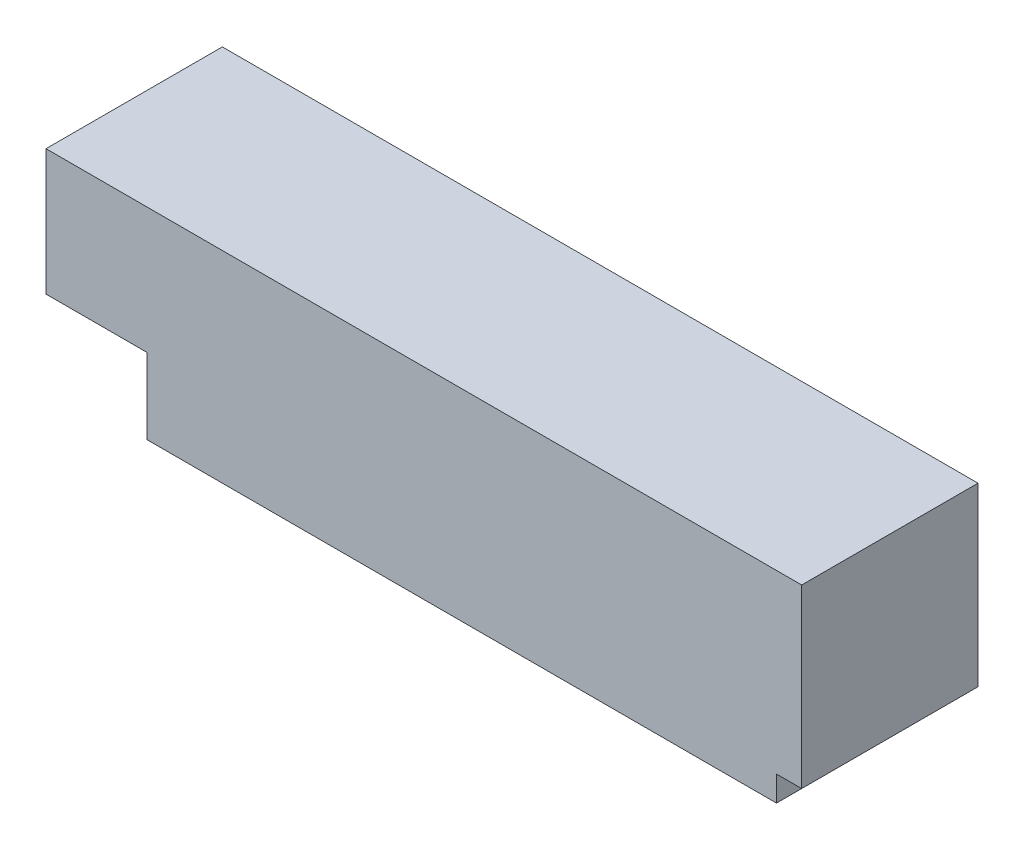
ISO-10303-21;
HEADER;
FILE_DESCRIPTION(('STEP AP214'),'2;1');
FILE_NAME('part.step','',(''),(''),'','','');
FILE_SCHEMA(('AUTOMOTIVE_DESIGN { 1 0 10303 214 1 1 1 1 }'));
ENDSEC;
DATA;
#1=APPLICATION_CONTEXT('core data for automotive mechanical design processes');
#2=APPLICATION_PROTOCOL_DEFINITION('international standard','automotive_design',2000,#1);
#3=PRODUCT_CONTEXT('',#1,'mechanical');
#4=PRODUCT('Part','Part','',(#3));
#5=PRODUCT_RELATED_PRODUCT_CATEGORY('part','',(#4));
#6=PRODUCT_DEFINITION_FORMATION('','',#4);
#7=PRODUCT_DEFINITION_CONTEXT('part definition',#1,'design');
#8=PRODUCT_DEFINITION('design','',#6,#7);
#9=PRODUCT_DEFINITION_SHAPE('','',#8);
#10=(LENGTH_UNIT() NAMED_UNIT(*) SI_UNIT(.MILLI.,.METRE.));
#11=(NAMED_UNIT(*) PLANE_ANGLE_UNIT() SI_UNIT($,.RADIAN.));
#12=(NAMED_UNIT(*) SI_UNIT($,.STERADIAN.) SOLID_ANGLE_UNIT());
#13=UNCERTAINTY_MEASURE_WITH_UNIT(LENGTH_MEASURE(1.E-05),#10,'distance_accuracy_value','');
#14=(GEOMETRIC_REPRESENTATION_CONTEXT(3) GLOBAL_UNCERTAINTY_ASSIGNED_CONTEXT((#13)) GLOBAL_UNIT_ASSIGNED_CONTEXT((#10,
#11,#12)) REPRESENTATION_CONTEXT('',''));
#15=CARTESIAN_POINT('',(0.,0.,0.));
#16=DIRECTION('',(0.,0.,1.));
#17=DIRECTION('',(1.,0.,0.));
#18=AXIS2_PLACEMENT_3D('',#15,#16,#17);
#19=CARTESIAN_POINT('',(25.,0.,7.));
#20=DIRECTION('',(0.,1.,0.));
#21=DIRECTION('',(-1.,0.,0.));
#22=AXIS2_PLACEMENT_3D('',#19,#20,#21);
#23=PLANE('',#22);
#24=DIRECTION('',(1.,0.,0.));
#25=VECTOR('',#24,1.);
#26=CARTESIAN_POINT('',(25.,0.,0.));
#27=LINE('',#26,#25);
#28=CARTESIAN_POINT('',(0.,0.,0.));
#29=VERTEX_POINT('',#28);
#30=CARTESIAN_POINT('',(25.,0.,0.));
#31=VERTEX_POINT('',#30);
#32=EDGE_CURVE('E129',#29,#31,#27,.T.);
#33=ORIENTED_EDGE('',*,*,#32,.T.);
#34=DIRECTION('',(0.,0.,-1.));
#35=VECTOR('',#34,1.);
#36=CARTESIAN_POINT('',(25.,0.,7.));
#37=LINE('',#36,#35);
#38=CARTESIAN_POINT('',(25.,0.,7.));
#39=VERTEX_POINT('',#38);
#40=EDGE_CURVE('E11',#39,#31,#37,.T.);
#41=ORIENTED_EDGE('',*,*,#40,.F.);
#42=DIRECTION('',(1.,0.,0.));
#43=VECTOR('',#42,1.);
#44=CARTESIAN_POINT('',(25.,0.,7.));
#45=LINE('',#44,#43);
#46=CARTESIAN_POINT('',(0.,0.,7.));
#47=VERTEX_POINT('',#46);
#48=EDGE_CURVE('E144',#47,#39,#45,.T.);
#49=ORIENTED_EDGE('',*,*,#48,.F.);
#50=DIRECTION('',(0.,0.,-1.));
#51=VECTOR('',#50,1.);
#52=CARTESIAN_POINT('',(0.,0.,7.));
#53=LINE('',#52,#51);
#54=EDGE_CURVE('E125',#47,#29,#53,.T.);
#55=ORIENTED_EDGE('',*,*,#54,.T.);
#56=EDGE_LOOP('',(#33,#41,#49,#55));
#57=FACE_BOUND('',#56,.T.);
#58=ADVANCED_FACE('F33',(#57),#23,.F.);
#59=CARTESIAN_POINT('',(25.,1.,7.));
#60=DIRECTION('',(-1.,0.,0.));
#61=DIRECTION('',(0.,0.,1.));
#62=AXIS2_PLACEMENT_3D('',#59,#60,#61);
#63=PLANE('',#62);
#64=DIRECTION('',(0.,1.,0.));
#65=VECTOR('',#64,1.);
#66=CARTESIAN_POINT('',(25.,1.,0.));
#67=LINE('',#66,#65);
#68=CARTESIAN_POINT('',(25.,1.,0.));
#69=VERTEX_POINT('',#68);
#70=EDGE_CURVE('E132',#31,#69,#67,.T.);
#71=ORIENTED_EDGE('',*,*,#70,.T.);
#72=DIRECTION('',(0.,0.,-1.));
#73=VECTOR('',#72,1.);
#74=CARTESIAN_POINT('',(25.,1.,7.));
#75=LINE('',#74,#73);
#76=CARTESIAN_POINT('',(25.,1.,7.));
#77=VERTEX_POINT('',#76);
#78=EDGE_CURVE('E41',#77,#69,#75,.T.);
#79=ORIENTED_EDGE('',*,*,#78,.F.);
#80=DIRECTION('',(0.,1.,0.));
#81=VECTOR('',#80,1.);
#82=CARTESIAN_POINT('',(25.,1.,7.));
#83=LINE('',#82,#81);
#84=EDGE_CURVE('E92',#39,#77,#83,.T.);
#85=ORIENTED_EDGE('',*,*,#84,.F.);
#86=ORIENTED_EDGE('',*,*,#40,.T.);
#87=EDGE_LOOP('',(#71,#79,#85,#86));
#88=FACE_BOUND('',#87,.T.);
#89=ADVANCED_FACE('F178',(#88),#63,.F.);
#90=CARTESIAN_POINT('',(26.,1.,7.));
#91=DIRECTION('',(0.,1.,0.));
#92=DIRECTION('',(-1.,0.,0.));
#93=AXIS2_PLACEMENT_3D('',#90,#91,#92);
#94=PLANE('',#93);
#95=DIRECTION('',(1.,0.,0.));
#96=VECTOR('',#95,1.);
#97=CARTESIAN_POINT('',(26.,1.,0.));
#98=LINE('',#97,#96);
#99=CARTESIAN_POINT('',(26.,1.,0.));
#100=VERTEX_POINT('',#99);
#101=EDGE_CURVE('E134',#69,#100,#98,.T.);
#102=ORIENTED_EDGE('',*,*,#101,.T.);
#103=DIRECTION('',(0.,0.,-1.));
#104=VECTOR('',#103,1.);
#105=CARTESIAN_POINT('',(26.,1.,7.));
#106=LINE('',#105,#104);
#107=CARTESIAN_POINT('',(26.,1.,7.));
#108=VERTEX_POINT('',#107);
#109=EDGE_CURVE('E151',#108,#100,#106,.T.);
#110=ORIENTED_EDGE('',*,*,#109,.F.);
#111=DIRECTION('',(1.,0.,0.));
#112=VECTOR('',#111,1.);
#113=CARTESIAN_POINT('',(26.,1.,7.));
#114=LINE('',#113,#112);
#115=EDGE_CURVE('E159',#77,#108,#114,.T.);
#116=ORIENTED_EDGE('',*,*,#115,.F.);
#117=ORIENTED_EDGE('',*,*,#78,.T.);
#118=EDGE_LOOP('',(#102,#110,#116,#117));
#119=FACE_BOUND('',#118,.T.);
#120=ADVANCED_FACE('F157',(#119),#94,.F.);
#121=CARTESIAN_POINT('',(26.,8.,7.));
#122=DIRECTION('',(-1.,0.,0.));
#123=DIRECTION('',(0.,0.,1.));
#124=AXIS2_PLACEMENT_3D('',#121,#122,#123);
#125=PLANE('',#124);
#126=DIRECTION('',(0.,1.,0.));
#127=VECTOR('',#126,1.);
#128=CARTESIAN_POINT('',(26.,8.,0.));
#129=LINE('',#128,#127);
#130=CARTESIAN_POINT('',(26.,8.,0.));
#131=VERTEX_POINT('',#130);
#132=EDGE_CURVE('E136',#100,#131,#129,.T.);
#133=ORIENTED_EDGE('',*,*,#132,.T.);
#134=DIRECTION('',(0.,0.,-1.));
#135=VECTOR('',#134,1.);
#136=CARTESIAN_POINT('',(26.,8.,7.));
#137=LINE('',#136,#135);
#138=CARTESIAN_POINT('',(26.,8.,7.));
#139=VERTEX_POINT('',#138);
#140=EDGE_CURVE('E148',#139,#131,#137,.T.);
#141=ORIENTED_EDGE('',*,*,#140,.F.);
#142=DIRECTION('',(0.,1.,0.));
#143=VECTOR('',#142,1.);
#144=CARTESIAN_POINT('',(26.,8.,7.));
#145=LINE('',#144,#143);
#146=EDGE_CURVE('E170',#108,#139,#145,.T.);
#147=ORIENTED_EDGE('',*,*,#146,.F.);
#148=ORIENTED_EDGE('',*,*,#109,.T.);
#149=EDGE_LOOP('',(#133,#141,#147,#148));
#150=FACE_BOUND('',#149,.T.);
#151=ADVANCED_FACE('F166',(#150),#125,.F.);
#152=CARTESIAN_POINT('',(-4.,8.,7.));
#153=DIRECTION('',(0.,-1.,0.));
#154=DIRECTION('',(0.,0.,-1.));
#155=AXIS2_PLACEMENT_3D('',#152,#153,#154);
#156=PLANE('',#155);
#157=DIRECTION('',(-1.,0.,0.));
#158=VECTOR('',#157,1.);
#159=CARTESIAN_POINT('',(-4.,8.,0.));
#160=LINE('',#159,#158);
#161=CARTESIAN_POINT('',(-4.,8.,0.));
#162=VERTEX_POINT('',#161);
#163=EDGE_CURVE('E139',#131,#162,#160,.T.);
#164=ORIENTED_EDGE('',*,*,#163,.T.);
#165=DIRECTION('',(0.,0.,-1.));
#166=VECTOR('',#165,1.);
#167=CARTESIAN_POINT('',(-4.,8.,7.));
#168=LINE('',#167,#166);
#169=CARTESIAN_POINT('',(-4.,8.,7.));
#170=VERTEX_POINT('',#169);
#171=EDGE_CURVE('E120',#170,#162,#168,.T.);
#172=ORIENTED_EDGE('',*,*,#171,.F.);
#173=DIRECTION('',(-1.,0.,0.));
#174=VECTOR('',#173,1.);
#175=CARTESIAN_POINT('',(3.30664659583847,8.,7.));
#176=LINE('',#175,#174);
#177=EDGE_CURVE('E111',#139,#170,#176,.T.);
#178=ORIENTED_EDGE('',*,*,#177,.F.);
#179=ORIENTED_EDGE('',*,*,#140,.T.);
#180=EDGE_LOOP('',(#164,#172,#178,#179));
#181=FACE_BOUND('',#180,.T.);
#182=ADVANCED_FACE('F169',(#181),#156,.F.);
#183=CARTESIAN_POINT('',(-4.,3.,7.));
#184=DIRECTION('',(1.,0.,0.));
#185=DIRECTION('',(0.,0.,-1.));
#186=AXIS2_PLACEMENT_3D('',#183,#184,#185);
#187=PLANE('',#186);
#188=DIRECTION('',(0.,-1.,0.));
#189=VECTOR('',#188,1.);
#190=CARTESIAN_POINT('',(-4.,3.,0.));
#191=LINE('',#190,#189);
#192=CARTESIAN_POINT('',(-4.,3.,0.));
#193=VERTEX_POINT('',#192);
#194=EDGE_CURVE('E119',#162,#193,#191,.T.);
#195=ORIENTED_EDGE('',*,*,#194,.T.);
#196=DIRECTION('',(0.,0.,-1.));
#197=VECTOR('',#196,1.);
#198=CARTESIAN_POINT('',(-4.,3.,7.));
#199=LINE('',#198,#197);
#200=CARTESIAN_POINT('',(-4.,3.,7.));
#201=VERTEX_POINT('',#200);
#202=EDGE_CURVE('E116',#201,#193,#199,.T.);
#203=ORIENTED_EDGE('',*,*,#202,.F.);
#204=DIRECTION('',(0.,-1.,0.));
#205=VECTOR('',#204,1.);
#206=CARTESIAN_POINT('',(-4.,3.,7.));
#207=LINE('',#206,#205);
#208=EDGE_CURVE('E105',#170,#201,#207,.T.);
#209=ORIENTED_EDGE('',*,*,#208,.F.);
#210=ORIENTED_EDGE('',*,*,#171,.T.);
#211=EDGE_LOOP('',(#195,#203,#209,#210));
#212=FACE_BOUND('',#211,.T.);
#213=ADVANCED_FACE('F117',(#212),#187,.F.);
#214=CARTESIAN_POINT('',(0.,3.,7.));
#215=DIRECTION('',(0.,1.,0.));
#216=DIRECTION('',(-1.,0.,0.));
#217=AXIS2_PLACEMENT_3D('',#214,#215,#216);
#218=PLANE('',#217);
#219=DIRECTION('',(1.,0.,0.));
#220=VECTOR('',#219,1.);
#221=CARTESIAN_POINT('',(0.,3.,0.));
#222=LINE('',#221,#220);
#223=CARTESIAN_POINT('',(0.,3.,0.));
#224=VERTEX_POINT('',#223);
#225=EDGE_CURVE('E78',#193,#224,#222,.T.);
#226=ORIENTED_EDGE('',*,*,#225,.T.);
#227=DIRECTION('',(0.,0.,-1.));
#228=VECTOR('',#227,1.);
#229=CARTESIAN_POINT('',(0.,3.,7.));
#230=LINE('',#229,#228);
#231=CARTESIAN_POINT('',(0.,3.,7.));
#232=VERTEX_POINT('',#231);
#233=EDGE_CURVE('E121',#232,#224,#230,.T.);
#234=ORIENTED_EDGE('',*,*,#233,.F.);
#235=DIRECTION('',(1.,0.,0.));
#236=VECTOR('',#235,1.);
#237=CARTESIAN_POINT('',(0.,3.,7.));
#238=LINE('',#237,#236);
#239=EDGE_CURVE('E109',#201,#232,#238,.T.);
#240=ORIENTED_EDGE('',*,*,#239,.F.);
#241=ORIENTED_EDGE('',*,*,#202,.T.);
#242=EDGE_LOOP('',(#226,#234,#240,#241));
#243=FACE_BOUND('',#242,.T.);
#244=ADVANCED_FACE('F123',(#243),#218,.F.);
#245=CARTESIAN_POINT('',(0.,0.,7.));
#246=DIRECTION('',(1.,0.,0.));
#247=DIRECTION('',(0.,0.,-1.));
#248=AXIS2_PLACEMENT_3D('',#245,#246,#247);
#249=PLANE('',#248);
#250=DIRECTION('',(0.,-1.,0.));
#251=VECTOR('',#250,1.);
#252=CARTESIAN_POINT('',(0.,0.,0.));
#253=LINE('',#252,#251);
#254=EDGE_CURVE('E84',#224,#29,#253,.T.);
#255=ORIENTED_EDGE('',*,*,#254,.T.);
#256=ORIENTED_EDGE('',*,*,#54,.F.);
#257=DIRECTION('',(0.,-1.,0.));
#258=VECTOR('',#257,1.);
#259=CARTESIAN_POINT('',(0.,0.,7.));
#260=LINE('',#259,#258);
#261=EDGE_CURVE('E49',#232,#47,#260,.T.);
#262=ORIENTED_EDGE('',*,*,#261,.F.);
#263=ORIENTED_EDGE('',*,*,#233,.T.);
#264=EDGE_LOOP('',(#255,#256,#262,#263));
#265=FACE_BOUND('',#264,.T.);
#266=ADVANCED_FACE('F194',(#265),#249,.F.);
#267=CARTESIAN_POINT('',(0.,0.,7.));
#268=DIRECTION('',(0.,0.,-1.));
#269=DIRECTION('',(-1.,0.,0.));
#270=AXIS2_PLACEMENT_3D('',#267,#268,#269);
#271=PLANE('',#270);
#272=ORIENTED_EDGE('',*,*,#48,.T.);
#273=ORIENTED_EDGE('',*,*,#84,.T.);
#274=ORIENTED_EDGE('',*,*,#115,.T.);
#275=ORIENTED_EDGE('',*,*,#146,.T.);
#276=ORIENTED_EDGE('',*,*,#177,.T.);
#277=ORIENTED_EDGE('',*,*,#208,.T.);
#278=ORIENTED_EDGE('',*,*,#239,.T.);
#279=ORIENTED_EDGE('',*,*,#261,.T.);
#280=EDGE_LOOP('',(#272,#273,#274,#275,#276,#277,#278,#279));
#281=FACE_BOUND('',#280,.T.);
#282=ADVANCED_FACE('F107',(#281),#271,.F.);
#283=CARTESIAN_POINT('',(0.,0.,0.));
#284=DIRECTION('',(0.,0.,-1.));
#285=DIRECTION('',(-1.,0.,0.));
#286=AXIS2_PLACEMENT_3D('',#283,#284,#285);
#287=PLANE('',#286);
#288=ORIENTED_EDGE('',*,*,#32,.F.);
#289=ORIENTED_EDGE('',*,*,#254,.F.);
#290=ORIENTED_EDGE('',*,*,#225,.F.);
#291=ORIENTED_EDGE('',*,*,#194,.F.);
#292=ORIENTED_EDGE('',*,*,#163,.F.);
#293=ORIENTED_EDGE('',*,*,#132,.F.);
#294=ORIENTED_EDGE('',*,*,#101,.F.);
#295=ORIENTED_EDGE('',*,*,#70,.F.);
#296=EDGE_LOOP('',(#288,#289,#290,#291,#292,#293,#294,#295));
#297=FACE_BOUND('',#296,.T.);
#298=ADVANCED_FACE('F163',(#297),#287,.T.);
#299=CLOSED_SHELL('',(#58,#89,#120,#151,#182,#213,#244,#266,#282,#298));
#300=MANIFOLD_SOLID_BREP('B2',#299);
#301=ADVANCED_BREP_SHAPE_REPRESENTATION('',(#18,#300),#14);
#302=SHAPE_DEFINITION_REPRESENTATION(#9,#301);
ENDSEC;
END-ISO-10303-21;
